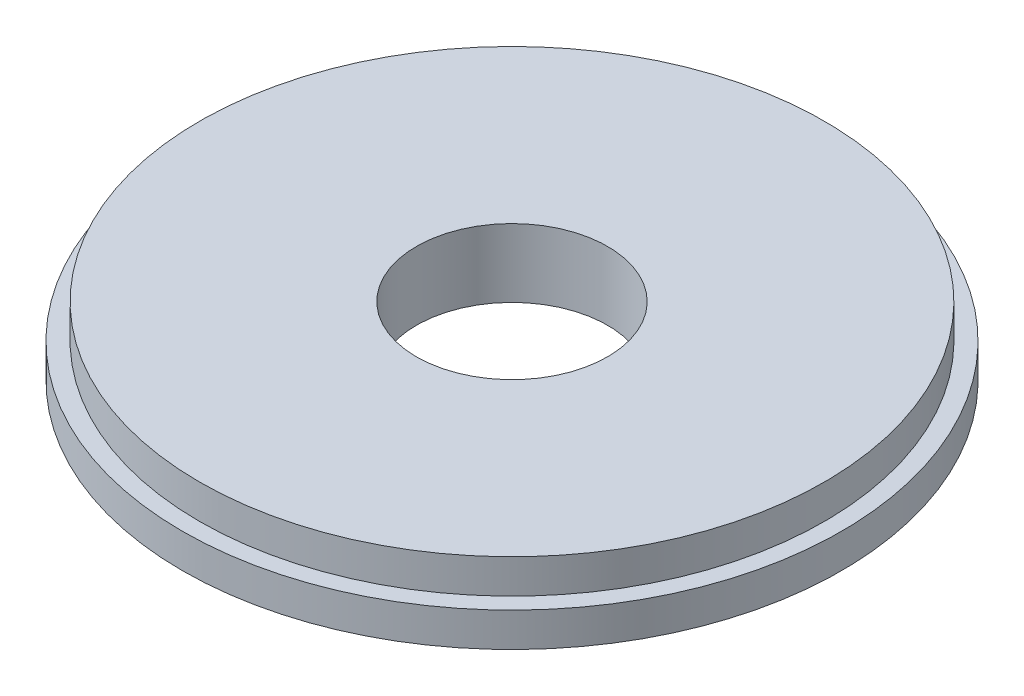
ISO-10303-21;
HEADER;
FILE_DESCRIPTION(('STEP AP214'),'2;1');
FILE_NAME('part.step','',(''),(''),'','','');
FILE_SCHEMA(('AUTOMOTIVE_DESIGN { 1 0 10303 214 1 1 1 1 }'));
ENDSEC;
DATA;
#1=APPLICATION_CONTEXT('core data for automotive mechanical design processes');
#2=APPLICATION_PROTOCOL_DEFINITION('international standard','automotive_design',2000,#1);
#3=PRODUCT_CONTEXT('',#1,'mechanical');
#4=PRODUCT('Part','Part','',(#3));
#5=PRODUCT_RELATED_PRODUCT_CATEGORY('part','',(#4));
#6=PRODUCT_DEFINITION_FORMATION('','',#4);
#7=PRODUCT_DEFINITION_CONTEXT('part definition',#1,'design');
#8=PRODUCT_DEFINITION('design','',#6,#7);
#9=PRODUCT_DEFINITION_SHAPE('','',#8);
#10=(LENGTH_UNIT() NAMED_UNIT(*) SI_UNIT(.MILLI.,.METRE.));
#11=(NAMED_UNIT(*) PLANE_ANGLE_UNIT() SI_UNIT($,.RADIAN.));
#12=(NAMED_UNIT(*) SI_UNIT($,.STERADIAN.) SOLID_ANGLE_UNIT());
#13=UNCERTAINTY_MEASURE_WITH_UNIT(LENGTH_MEASURE(1.E-05),#10,'distance_accuracy_value','');
#14=(GEOMETRIC_REPRESENTATION_CONTEXT(3) GLOBAL_UNCERTAINTY_ASSIGNED_CONTEXT((#13)) GLOBAL_UNIT_ASSIGNED_CONTEXT((#10,
#11,#12)) REPRESENTATION_CONTEXT('',''));
#15=CARTESIAN_POINT('',(0.,0.,0.));
#16=DIRECTION('',(0.,0.,1.));
#17=DIRECTION('',(1.,0.,0.));
#18=AXIS2_PLACEMENT_3D('',#15,#16,#17);
#19=CARTESIAN_POINT('',(0.,5.,0.));
#20=DIRECTION('',(0.,-1.,0.));
#21=DIRECTION('',(0.,0.,-1.));
#22=AXIS2_PLACEMENT_3D('',#19,#20,#21);
#23=CYLINDRICAL_SURFACE('',#22,48.25);
#24=CARTESIAN_POINT('',(0.,5.,0.));
#25=DIRECTION('',(0.,1.,0.));
#26=DIRECTION('',(0.,0.,1.));
#27=AXIS2_PLACEMENT_3D('',#24,#25,#26);
#28=CIRCLE('',#27,48.25);
#29=CARTESIAN_POINT('',(0.,5.,48.25));
#30=VERTEX_POINT('',#29);
#31=EDGE_CURVE('E38',#30,#30,#28,.T.);
#32=ORIENTED_EDGE('',*,*,#31,.F.);
#33=EDGE_LOOP('',(#32));
#34=FACE_BOUND('',#33,.T.);
#35=CARTESIAN_POINT('',(0.,0.,0.));
#36=DIRECTION('',(0.,1.,0.));
#37=DIRECTION('',(0.,0.,1.));
#38=AXIS2_PLACEMENT_3D('',#35,#36,#37);
#39=CIRCLE('',#38,48.25);
#40=CARTESIAN_POINT('',(0.,0.,48.25));
#41=VERTEX_POINT('',#40);
#42=EDGE_CURVE('E34',#41,#41,#39,.T.);
#43=ORIENTED_EDGE('',*,*,#42,.T.);
#44=EDGE_LOOP('',(#43));
#45=FACE_BOUND('',#44,.T.);
#46=ADVANCED_FACE('F31',(#34,#45),#23,.T.);
#47=CARTESIAN_POINT('',(0.,5.,0.));
#48=DIRECTION('',(0.,1.,0.));
#49=DIRECTION('',(0.,0.,1.));
#50=AXIS2_PLACEMENT_3D('',#47,#48,#49);
#51=PLANE('',#50);
#52=CARTESIAN_POINT('',(0.,5.,0.));
#53=DIRECTION('',(0.,1.,0.));
#54=DIRECTION('',(0.,0.,1.));
#55=AXIS2_PLACEMENT_3D('',#52,#53,#54);
#56=CIRCLE('',#55,45.75);
#57=CARTESIAN_POINT('',(0.,5.,45.75));
#58=VERTEX_POINT('',#57);
#59=EDGE_CURVE('E10',#58,#58,#56,.T.);
#60=ORIENTED_EDGE('',*,*,#59,.F.);
#61=EDGE_LOOP('',(#60));
#62=FACE_BOUND('',#61,.T.);
#63=ORIENTED_EDGE('',*,*,#31,.T.);
#64=EDGE_LOOP('',(#63));
#65=FACE_BOUND('',#64,.T.);
#66=ADVANCED_FACE('F75',(#62,#65),#51,.T.);
#67=CARTESIAN_POINT('',(0.,0.,0.));
#68=DIRECTION('',(0.,1.,0.));
#69=DIRECTION('',(0.,0.,1.));
#70=AXIS2_PLACEMENT_3D('',#67,#68,#69);
#71=PLANE('',#70);
#72=CARTESIAN_POINT('',(0.,0.,0.));
#73=DIRECTION('',(0.,1.,0.));
#74=DIRECTION('',(0.,0.,1.));
#75=AXIS2_PLACEMENT_3D('',#72,#73,#74);
#76=CIRCLE('',#75,14.);
#77=CARTESIAN_POINT('',(0.,0.,14.));
#78=VERTEX_POINT('',#77);
#79=EDGE_CURVE('E47',#78,#78,#76,.T.);
#80=ORIENTED_EDGE('',*,*,#79,.T.);
#81=EDGE_LOOP('',(#80));
#82=FACE_BOUND('',#81,.T.);
#83=ORIENTED_EDGE('',*,*,#42,.F.);
#84=EDGE_LOOP('',(#83));
#85=FACE_BOUND('',#84,.T.);
#86=ADVANCED_FACE('F54',(#82,#85),#71,.F.);
#87=CARTESIAN_POINT('',(0.,10.,0.));
#88=DIRECTION('',(0.,-1.,0.));
#89=DIRECTION('',(0.,0.,-1.));
#90=AXIS2_PLACEMENT_3D('',#87,#88,#89);
#91=CYLINDRICAL_SURFACE('',#90,45.75);
#92=CARTESIAN_POINT('',(0.,10.,0.));
#93=DIRECTION('',(0.,1.,0.));
#94=DIRECTION('',(0.,0.,1.));
#95=AXIS2_PLACEMENT_3D('',#92,#93,#94);
#96=CIRCLE('',#95,45.75);
#97=CARTESIAN_POINT('',(0.,10.,45.75));
#98=VERTEX_POINT('',#97);
#99=EDGE_CURVE('E44',#98,#98,#96,.T.);
#100=ORIENTED_EDGE('',*,*,#99,.F.);
#101=EDGE_LOOP('',(#100));
#102=FACE_BOUND('',#101,.T.);
#103=ORIENTED_EDGE('',*,*,#59,.T.);
#104=EDGE_LOOP('',(#103));
#105=FACE_BOUND('',#104,.T.);
#106=ADVANCED_FACE('F66',(#102,#105),#91,.T.);
#107=CARTESIAN_POINT('',(0.,10.,0.));
#108=DIRECTION('',(0.,1.,0.));
#109=DIRECTION('',(0.,0.,1.));
#110=AXIS2_PLACEMENT_3D('',#107,#108,#109);
#111=PLANE('',#110);
#112=CARTESIAN_POINT('',(0.,10.,0.));
#113=DIRECTION('',(0.,1.,0.));
#114=DIRECTION('',(0.,0.,1.));
#115=AXIS2_PLACEMENT_3D('',#112,#113,#114);
#116=CIRCLE('',#115,14.);
#117=CARTESIAN_POINT('',(0.,10.,14.));
#118=VERTEX_POINT('',#117);
#119=EDGE_CURVE('E48',#118,#118,#116,.T.);
#120=ORIENTED_EDGE('',*,*,#119,.F.);
#121=EDGE_LOOP('',(#120));
#122=FACE_BOUND('',#121,.T.);
#123=ORIENTED_EDGE('',*,*,#99,.T.);
#124=EDGE_LOOP('',(#123));
#125=FACE_BOUND('',#124,.T.);
#126=ADVANCED_FACE('F60',(#122,#125),#111,.T.);
#127=CARTESIAN_POINT('',(0.,0.,0.));
#128=DIRECTION('',(0.,1.,0.));
#129=DIRECTION('',(0.,0.,1.));
#130=AXIS2_PLACEMENT_3D('',#127,#128,#129);
#131=CYLINDRICAL_SURFACE('',#130,14.);
#132=ORIENTED_EDGE('',*,*,#79,.F.);
#133=EDGE_LOOP('',(#132));
#134=FACE_BOUND('',#133,.T.);
#135=ORIENTED_EDGE('',*,*,#119,.T.);
#136=EDGE_LOOP('',(#135));
#137=FACE_BOUND('',#136,.T.);
#138=ADVANCED_FACE('F57',(#134,#137),#131,.F.);
#139=CLOSED_SHELL('',(#46,#66,#86,#106,#126,#138));
#140=MANIFOLD_SOLID_BREP('B2',#139);
#141=ADVANCED_BREP_SHAPE_REPRESENTATION('',(#18,#140),#14);
#142=SHAPE_DEFINITION_REPRESENTATION(#9,#141);
ENDSEC;
END-ISO-10303-21;
